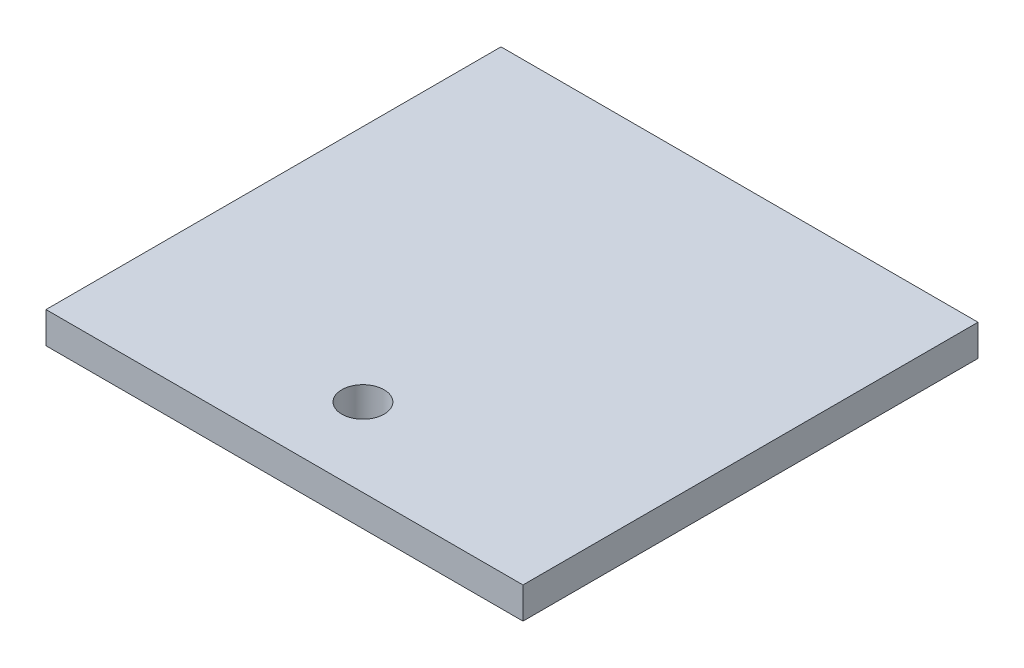
ISO-10303-21;
HEADER;
FILE_DESCRIPTION(('STEP AP214'),'2;1');
FILE_NAME('part.step','',(''),(''),'','','');
FILE_SCHEMA(('AUTOMOTIVE_DESIGN { 1 0 10303 214 1 1 1 1 }'));
ENDSEC;
DATA;
#1=APPLICATION_CONTEXT('core data for automotive mechanical design processes');
#2=APPLICATION_PROTOCOL_DEFINITION('international standard','automotive_design',2000,#1);
#3=PRODUCT_CONTEXT('',#1,'mechanical');
#4=PRODUCT('Part','Part','',(#3));
#5=PRODUCT_RELATED_PRODUCT_CATEGORY('part','',(#4));
#6=PRODUCT_DEFINITION_FORMATION('','',#4);
#7=PRODUCT_DEFINITION_CONTEXT('part definition',#1,'design');
#8=PRODUCT_DEFINITION('design','',#6,#7);
#9=PRODUCT_DEFINITION_SHAPE('','',#8);
#10=(LENGTH_UNIT() NAMED_UNIT(*) SI_UNIT(.MILLI.,.METRE.));
#11=(NAMED_UNIT(*) PLANE_ANGLE_UNIT() SI_UNIT($,.RADIAN.));
#12=(NAMED_UNIT(*) SI_UNIT($,.STERADIAN.) SOLID_ANGLE_UNIT());
#13=UNCERTAINTY_MEASURE_WITH_UNIT(LENGTH_MEASURE(1.E-05),#10,'distance_accuracy_value','');
#14=(GEOMETRIC_REPRESENTATION_CONTEXT(3) GLOBAL_UNCERTAINTY_ASSIGNED_CONTEXT((#13)) GLOBAL_UNIT_ASSIGNED_CONTEXT((#10,
#11,#12)) REPRESENTATION_CONTEXT('',''));
#15=CARTESIAN_POINT('',(0.,0.,0.));
#16=DIRECTION('',(0.,0.,1.));
#17=DIRECTION('',(1.,0.,0.));
#18=AXIS2_PLACEMENT_3D('',#15,#16,#17);
#19=CARTESIAN_POINT('',(-76.,10.,72.5));
#20=DIRECTION('',(0.,0.,-1.));
#21=DIRECTION('',(-1.,0.,0.));
#22=AXIS2_PLACEMENT_3D('',#19,#20,#21);
#23=PLANE('',#22);
#24=DIRECTION('',(1.,0.,0.));
#25=VECTOR('',#24,1.);
#26=CARTESIAN_POINT('',(-76.,0.,72.5));
#27=LINE('',#26,#25);
#28=CARTESIAN_POINT('',(-76.,0.,72.5));
#29=VERTEX_POINT('',#28);
#30=CARTESIAN_POINT('',(76.,0.,72.5));
#31=VERTEX_POINT('',#30);
#32=EDGE_CURVE('E96',#29,#31,#27,.T.);
#33=ORIENTED_EDGE('',*,*,#32,.T.);
#34=DIRECTION('',(0.,-1.,0.));
#35=VECTOR('',#34,1.);
#36=CARTESIAN_POINT('',(76.,10.,72.5));
#37=LINE('',#36,#35);
#38=CARTESIAN_POINT('',(76.,10.,72.5));
#39=VERTEX_POINT('',#38);
#40=EDGE_CURVE('E11',#39,#31,#37,.T.);
#41=ORIENTED_EDGE('',*,*,#40,.F.);
#42=DIRECTION('',(1.,0.,0.));
#43=VECTOR('',#42,1.);
#44=CARTESIAN_POINT('',(-76.,10.,72.5));
#45=LINE('',#44,#43);
#46=CARTESIAN_POINT('',(-76.,10.,72.5));
#47=VERTEX_POINT('',#46);
#48=EDGE_CURVE('E82',#47,#39,#45,.T.);
#49=ORIENTED_EDGE('',*,*,#48,.F.);
#50=DIRECTION('',(0.,-1.,0.));
#51=VECTOR('',#50,1.);
#52=CARTESIAN_POINT('',(-76.,10.,72.5));
#53=LINE('',#52,#51);
#54=EDGE_CURVE('E49',#47,#29,#53,.T.);
#55=ORIENTED_EDGE('',*,*,#54,.T.);
#56=EDGE_LOOP('',(#33,#41,#49,#55));
#57=FACE_BOUND('',#56,.T.);
#58=ADVANCED_FACE('F33',(#57),#23,.F.);
#59=CARTESIAN_POINT('',(76.,10.,72.5));
#60=DIRECTION('',(-1.,0.,0.));
#61=DIRECTION('',(0.,0.,1.));
#62=AXIS2_PLACEMENT_3D('',#59,#60,#61);
#63=PLANE('',#62);
#64=DIRECTION('',(0.,0.,-1.));
#65=VECTOR('',#64,1.);
#66=CARTESIAN_POINT('',(76.,0.,72.5));
#67=LINE('',#66,#65);
#68=CARTESIAN_POINT('',(76.,0.,-72.5));
#69=VERTEX_POINT('',#68);
#70=EDGE_CURVE('E87',#31,#69,#67,.T.);
#71=ORIENTED_EDGE('',*,*,#70,.T.);
#72=DIRECTION('',(0.,-1.,0.));
#73=VECTOR('',#72,1.);
#74=CARTESIAN_POINT('',(76.,10.,-72.5));
#75=LINE('',#74,#73);
#76=CARTESIAN_POINT('',(76.,10.,-72.5));
#77=VERTEX_POINT('',#76);
#78=EDGE_CURVE('E41',#77,#69,#75,.T.);
#79=ORIENTED_EDGE('',*,*,#78,.F.);
#80=DIRECTION('',(0.,0.,-1.));
#81=VECTOR('',#80,1.);
#82=CARTESIAN_POINT('',(76.,10.,72.5));
#83=LINE('',#82,#81);
#84=EDGE_CURVE('E74',#39,#77,#83,.T.);
#85=ORIENTED_EDGE('',*,*,#84,.F.);
#86=ORIENTED_EDGE('',*,*,#40,.T.);
#87=EDGE_LOOP('',(#71,#79,#85,#86));
#88=FACE_BOUND('',#87,.T.);
#89=ADVANCED_FACE('F86',(#88),#63,.F.);
#90=CARTESIAN_POINT('',(-76.,10.,-72.5));
#91=DIRECTION('',(0.,0.,-1.));
#92=DIRECTION('',(-1.,0.,0.));
#93=AXIS2_PLACEMENT_3D('',#90,#91,#92);
#94=PLANE('',#93);
#95=DIRECTION('',(1.,0.,0.));
#96=VECTOR('',#95,1.);
#97=CARTESIAN_POINT('',(-76.,0.,-72.5));
#98=LINE('',#97,#96);
#99=CARTESIAN_POINT('',(-76.,0.,-72.5));
#100=VERTEX_POINT('',#99);
#101=EDGE_CURVE('E100',#100,#69,#98,.T.);
#102=ORIENTED_EDGE('',*,*,#101,.F.);
#103=DIRECTION('',(0.,-1.,0.));
#104=VECTOR('',#103,1.);
#105=CARTESIAN_POINT('',(-76.,10.,-72.5));
#106=LINE('',#105,#104);
#107=CARTESIAN_POINT('',(-76.,10.,-72.5));
#108=VERTEX_POINT('',#107);
#109=EDGE_CURVE('E63',#108,#100,#106,.T.);
#110=ORIENTED_EDGE('',*,*,#109,.F.);
#111=DIRECTION('',(1.,0.,0.));
#112=VECTOR('',#111,1.);
#113=CARTESIAN_POINT('',(-76.,10.,-72.5));
#114=LINE('',#113,#112);
#115=EDGE_CURVE('E81',#108,#77,#114,.T.);
#116=ORIENTED_EDGE('',*,*,#115,.T.);
#117=ORIENTED_EDGE('',*,*,#78,.T.);
#118=EDGE_LOOP('',(#102,#110,#116,#117));
#119=FACE_BOUND('',#118,.T.);
#120=ADVANCED_FACE('F90',(#119),#94,.T.);
#121=CARTESIAN_POINT('',(-76.,10.,72.5));
#122=DIRECTION('',(-1.,0.,0.));
#123=DIRECTION('',(0.,0.,1.));
#124=AXIS2_PLACEMENT_3D('',#121,#122,#123);
#125=PLANE('',#124);
#126=DIRECTION('',(0.,0.,-1.));
#127=VECTOR('',#126,1.);
#128=CARTESIAN_POINT('',(-76.,0.,72.5));
#129=LINE('',#128,#127);
#130=EDGE_CURVE('E102',#29,#100,#129,.T.);
#131=ORIENTED_EDGE('',*,*,#130,.F.);
#132=ORIENTED_EDGE('',*,*,#54,.F.);
#133=DIRECTION('',(0.,0.,-1.));
#134=VECTOR('',#133,1.);
#135=CARTESIAN_POINT('',(-76.,10.,72.5));
#136=LINE('',#135,#134);
#137=EDGE_CURVE('E91',#47,#108,#136,.T.);
#138=ORIENTED_EDGE('',*,*,#137,.T.);
#139=ORIENTED_EDGE('',*,*,#109,.T.);
#140=EDGE_LOOP('',(#131,#132,#138,#139));
#141=FACE_BOUND('',#140,.T.);
#142=ADVANCED_FACE('F130',(#141),#125,.T.);
#143=CARTESIAN_POINT('',(0.,10.,0.));
#144=DIRECTION('',(0.,1.,0.));
#145=DIRECTION('',(0.,0.,1.));
#146=AXIS2_PLACEMENT_3D('',#143,#144,#145);
#147=PLANE('',#146);
#148=CARTESIAN_POINT('',(0.,10.,47.5));
#149=DIRECTION('',(0.,1.,0.));
#150=DIRECTION('',(0.,0.,1.));
#151=AXIS2_PLACEMENT_3D('',#148,#149,#150);
#152=CIRCLE('',#151,6.75);
#153=CARTESIAN_POINT('',(0.,10.,54.25));
#154=VERTEX_POINT('',#153);
#155=EDGE_CURVE('E98',#154,#154,#152,.F.);
#156=ORIENTED_EDGE('',*,*,#155,.T.);
#157=EDGE_LOOP('',(#156));
#158=FACE_BOUND('',#157,.T.);
#159=ORIENTED_EDGE('',*,*,#48,.T.);
#160=ORIENTED_EDGE('',*,*,#84,.T.);
#161=ORIENTED_EDGE('',*,*,#115,.F.);
#162=ORIENTED_EDGE('',*,*,#137,.F.);
#163=EDGE_LOOP('',(#159,#160,#161,#162));
#164=FACE_BOUND('',#163,.T.);
#165=ADVANCED_FACE('F78',(#158,#164),#147,.T.);
#166=CARTESIAN_POINT('',(0.,0.,0.));
#167=DIRECTION('',(0.,1.,0.));
#168=DIRECTION('',(0.,0.,1.));
#169=AXIS2_PLACEMENT_3D('',#166,#167,#168);
#170=PLANE('',#169);
#171=CARTESIAN_POINT('',(0.,0.,47.5));
#172=DIRECTION('',(0.,1.,0.));
#173=DIRECTION('',(0.,0.,1.));
#174=AXIS2_PLACEMENT_3D('',#171,#172,#173);
#175=CIRCLE('',#174,6.75);
#176=CARTESIAN_POINT('',(0.,0.,54.25));
#177=VERTEX_POINT('',#176);
#178=EDGE_CURVE('E110',#177,#177,#175,.T.);
#179=ORIENTED_EDGE('',*,*,#178,.T.);
#180=EDGE_LOOP('',(#179));
#181=FACE_BOUND('',#180,.T.);
#182=ORIENTED_EDGE('',*,*,#32,.F.);
#183=ORIENTED_EDGE('',*,*,#130,.T.);
#184=ORIENTED_EDGE('',*,*,#101,.T.);
#185=ORIENTED_EDGE('',*,*,#70,.F.);
#186=EDGE_LOOP('',(#182,#183,#184,#185));
#187=FACE_BOUND('',#186,.T.);
#188=ADVANCED_FACE('F114',(#181,#187),#170,.F.);
#189=CARTESIAN_POINT('',(0.,18.,47.5));
#190=DIRECTION('',(0.,-1.,0.));
#191=DIRECTION('',(0.,0.,-1.));
#192=AXIS2_PLACEMENT_3D('',#189,#190,#191);
#193=CYLINDRICAL_SURFACE('',#192,6.75);
#194=ORIENTED_EDGE('',*,*,#155,.F.);
#195=EDGE_LOOP('',(#194));
#196=FACE_BOUND('',#195,.T.);
#197=ORIENTED_EDGE('',*,*,#178,.F.);
#198=EDGE_LOOP('',(#197));
#199=FACE_BOUND('',#198,.T.);
#200=ADVANCED_FACE('F116',(#196,#199),#193,.F.);
#201=CLOSED_SHELL('',(#58,#89,#120,#142,#165,#188,#200));
#202=MANIFOLD_SOLID_BREP('B2',#201);
#203=ADVANCED_BREP_SHAPE_REPRESENTATION('',(#18,#202),#14);
#204=SHAPE_DEFINITION_REPRESENTATION(#9,#203);
ENDSEC;
END-ISO-10303-21;
